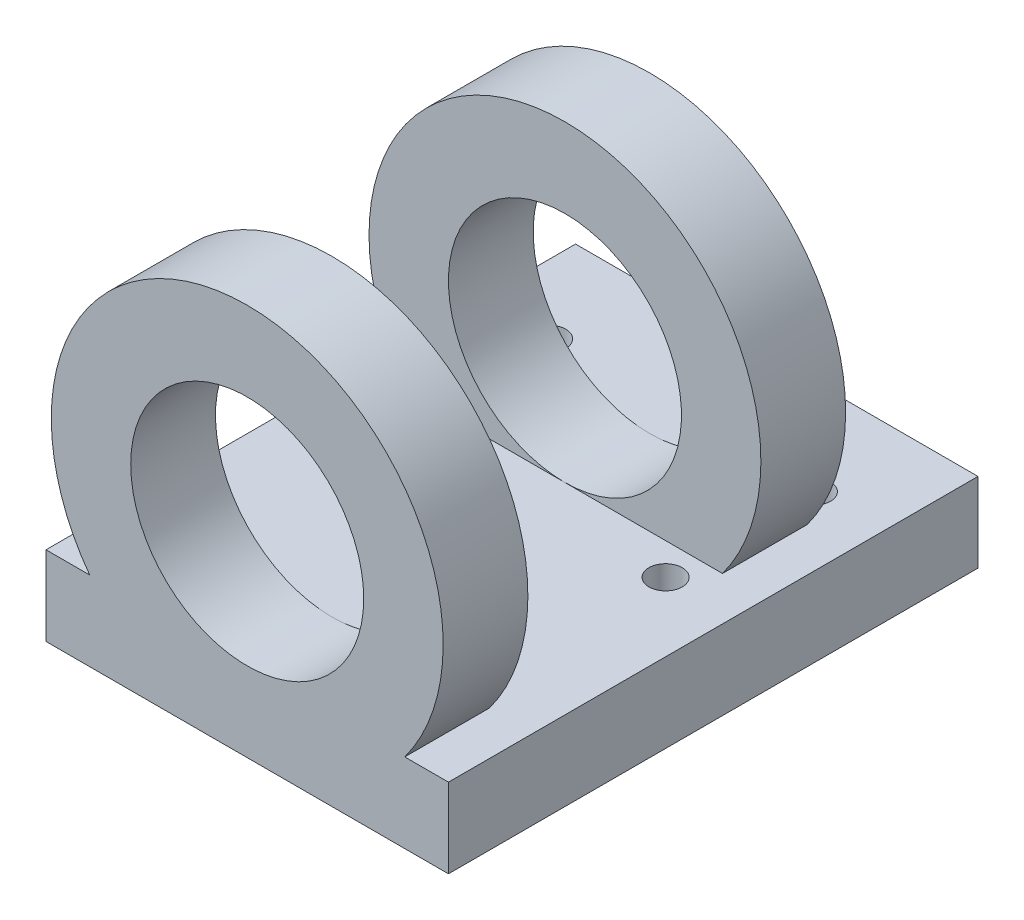
ISO-10303-21;
HEADER;
FILE_DESCRIPTION(('STEP AP214'),'2;1');
FILE_NAME('part.step','',(''),(''),'','','');
FILE_SCHEMA(('AUTOMOTIVE_DESIGN { 1 0 10303 214 1 1 1 1 }'));
ENDSEC;
DATA;
#1=APPLICATION_CONTEXT('core data for automotive mechanical design processes');
#2=APPLICATION_PROTOCOL_DEFINITION('international standard','automotive_design',2000,#1);
#3=PRODUCT_CONTEXT('',#1,'mechanical');
#4=PRODUCT('Part','Part','',(#3));
#5=PRODUCT_RELATED_PRODUCT_CATEGORY('part','',(#4));
#6=PRODUCT_DEFINITION_FORMATION('','',#4);
#7=PRODUCT_DEFINITION_CONTEXT('part definition',#1,'design');
#8=PRODUCT_DEFINITION('design','',#6,#7);
#9=PRODUCT_DEFINITION_SHAPE('','',#8);
#10=(LENGTH_UNIT() NAMED_UNIT(*) SI_UNIT(.MILLI.,.METRE.));
#11=(NAMED_UNIT(*) PLANE_ANGLE_UNIT() SI_UNIT($,.RADIAN.));
#12=(NAMED_UNIT(*) SI_UNIT($,.STERADIAN.) SOLID_ANGLE_UNIT());
#13=UNCERTAINTY_MEASURE_WITH_UNIT(LENGTH_MEASURE(1.E-05),#10,'distance_accuracy_value','');
#14=(GEOMETRIC_REPRESENTATION_CONTEXT(3) GLOBAL_UNCERTAINTY_ASSIGNED_CONTEXT((#13)) GLOBAL_UNIT_ASSIGNED_CONTEXT((#10,
#11,#12)) REPRESENTATION_CONTEXT('',''));
#15=CARTESIAN_POINT('',(0.,0.,0.));
#16=DIRECTION('',(0.,0.,1.));
#17=DIRECTION('',(1.,0.,0.));
#18=AXIS2_PLACEMENT_3D('',#15,#16,#17);
#19=CARTESIAN_POINT('',(0.,-11.,-20.));
#20=DIRECTION('',(0.,-1.,0.));
#21=DIRECTION('',(0.,0.,-1.));
#22=AXIS2_PLACEMENT_3D('',#19,#20,#21);
#23=PLANE('',#22);
#24=CARTESIAN_POINT('',(-12.5,-11.,-11.));
#25=DIRECTION('',(0.,1.,0.));
#26=DIRECTION('',(0.,0.,1.));
#27=AXIS2_PLACEMENT_3D('',#24,#25,#26);
#28=CIRCLE('',#27,1.575);
#29=CARTESIAN_POINT('',(-12.5,-11.,-9.425));
#30=VERTEX_POINT('',#29);
#31=EDGE_CURVE('E267',#30,#30,#28,.T.);
#32=ORIENTED_EDGE('',*,*,#31,.F.);
#33=EDGE_LOOP('',(#32));
#34=FACE_BOUND('',#33,.T.);
#35=CARTESIAN_POINT('',(12.5,-11.,-11.));
#36=DIRECTION('',(0.,-1.,0.));
#37=DIRECTION('',(0.,0.,-1.));
#38=AXIS2_PLACEMENT_3D('',#35,#36,#37);
#39=CIRCLE('',#38,1.57500000000002);
#40=CARTESIAN_POINT('',(12.5,-11.,-12.575));
#41=VERTEX_POINT('',#40);
#42=EDGE_CURVE('E266',#41,#41,#39,.T.);
#43=ORIENTED_EDGE('',*,*,#42,.T.);
#44=EDGE_LOOP('',(#43));
#45=FACE_BOUND('',#44,.T.);
#46=CARTESIAN_POINT('',(-12.5,-11.,3.));
#47=DIRECTION('',(0.,-1.,0.));
#48=DIRECTION('',(0.,0.,-1.));
#49=AXIS2_PLACEMENT_3D('',#46,#47,#48);
#50=CIRCLE('',#49,1.575);
#51=CARTESIAN_POINT('',(-12.5,-11.,1.425));
#52=VERTEX_POINT('',#51);
#53=EDGE_CURVE('E277',#52,#52,#50,.T.);
#54=ORIENTED_EDGE('',*,*,#53,.T.);
#55=EDGE_LOOP('',(#54));
#56=FACE_BOUND('',#55,.T.);
#57=DIRECTION('',(-1.,0.,0.));
#58=VECTOR('',#57,1.);
#59=CARTESIAN_POINT('',(0.,-11.,22.));
#60=LINE('',#59,#58);
#61=CARTESIAN_POINT('',(14.8744747806435,-11.,22.));
#62=VERTEX_POINT('',#61);
#63=CARTESIAN_POINT('',(0.,-11.,22.));
#64=VERTEX_POINT('',#63);
#65=EDGE_CURVE('E60',#62,#64,#60,.T.);
#66=ORIENTED_EDGE('',*,*,#65,.F.);
#67=DIRECTION('',(0.,0.,1.));
#68=VECTOR('',#67,1.);
#69=CARTESIAN_POINT('',(14.8744747806435,-11.,22.));
#70=LINE('',#69,#68);
#71=CARTESIAN_POINT('',(14.8744747806435,-11.,30.));
#72=VERTEX_POINT('',#71);
#73=EDGE_CURVE('E299',#62,#72,#70,.T.);
#74=ORIENTED_EDGE('',*,*,#73,.T.);
#75=DIRECTION('',(1.,0.,0.));
#76=VECTOR('',#75,1.);
#77=CARTESIAN_POINT('',(0.,-11.,30.));
#78=LINE('',#77,#76);
#79=CARTESIAN_POINT('',(19.,-11.,30.));
#80=VERTEX_POINT('',#79);
#81=EDGE_CURVE('E138',#72,#80,#78,.T.);
#82=ORIENTED_EDGE('',*,*,#81,.T.);
#83=DIRECTION('',(0.,0.,1.));
#84=VECTOR('',#83,1.);
#85=CARTESIAN_POINT('',(19.,-11.,-20.));
#86=LINE('',#85,#84);
#87=CARTESIAN_POINT('',(19.,-11.,-20.));
#88=VERTEX_POINT('',#87);
#89=EDGE_CURVE('E158',#88,#80,#86,.T.);
#90=ORIENTED_EDGE('',*,*,#89,.F.);
#91=DIRECTION('',(1.,0.,0.));
#92=VECTOR('',#91,1.);
#93=CARTESIAN_POINT('',(0.,-11.,-20.));
#94=LINE('',#93,#92);
#95=CARTESIAN_POINT('',(-19.,-11.,-20.));
#96=VERTEX_POINT('',#95);
#97=EDGE_CURVE('E122',#96,#88,#94,.T.);
#98=ORIENTED_EDGE('',*,*,#97,.F.);
#99=DIRECTION('',(0.,0.,1.));
#100=VECTOR('',#99,1.);
#101=CARTESIAN_POINT('',(-19.,-11.,-20.));
#102=LINE('',#101,#100);
#103=CARTESIAN_POINT('',(-19.,-11.,30.));
#104=VERTEX_POINT('',#103);
#105=EDGE_CURVE('E117',#96,#104,#102,.T.);
#106=ORIENTED_EDGE('',*,*,#105,.T.);
#107=CARTESIAN_POINT('',(-14.8744747806435,-11.,30.));
#108=VERTEX_POINT('',#107);
#109=EDGE_CURVE('E120',#104,#108,#78,.T.);
#110=ORIENTED_EDGE('',*,*,#109,.T.);
#111=DIRECTION('',(0.,0.,1.));
#112=VECTOR('',#111,1.);
#113=CARTESIAN_POINT('',(-14.8744747806435,-11.,22.));
#114=LINE('',#113,#112);
#115=CARTESIAN_POINT('',(-14.8744747806435,-11.,22.));
#116=VERTEX_POINT('',#115);
#117=EDGE_CURVE('E66',#108,#116,#114,.F.);
#118=ORIENTED_EDGE('',*,*,#117,.T.);
#119=EDGE_CURVE('E300',#64,#116,#60,.T.);
#120=ORIENTED_EDGE('',*,*,#119,.F.);
#121=EDGE_LOOP('',(#66,#74,#82,#90,#98,#106,#110,#118,#120));
#122=FACE_BOUND('',#121,.T.);
#123=DIRECTION('',(0.,0.,1.));
#124=VECTOR('',#123,1.);
#125=CARTESIAN_POINT('',(-14.8744747806435,-11.,-8.));
#126=LINE('',#125,#124);
#127=CARTESIAN_POINT('',(-14.8744747806435,-11.,-8.));
#128=VERTEX_POINT('',#127);
#129=CARTESIAN_POINT('',(-14.8744747806435,-11.,0.));
#130=VERTEX_POINT('',#129);
#131=EDGE_CURVE('E175',#128,#130,#126,.T.);
#132=ORIENTED_EDGE('',*,*,#131,.F.);
#133=DIRECTION('',(1.,0.,0.));
#134=VECTOR('',#133,1.);
#135=CARTESIAN_POINT('',(0.,-11.,-8.));
#136=LINE('',#135,#134);
#137=CARTESIAN_POINT('',(0.,-11.,-8.));
#138=VERTEX_POINT('',#137);
#139=EDGE_CURVE('E172',#128,#138,#136,.T.);
#140=ORIENTED_EDGE('',*,*,#139,.T.);
#141=CARTESIAN_POINT('',(14.8744747806435,-11.,-8.));
#142=VERTEX_POINT('',#141);
#143=EDGE_CURVE('E168',#138,#142,#136,.T.);
#144=ORIENTED_EDGE('',*,*,#143,.T.);
#145=DIRECTION('',(0.,0.,1.));
#146=VECTOR('',#145,1.);
#147=CARTESIAN_POINT('',(14.8744747806435,-11.,-8.));
#148=LINE('',#147,#146);
#149=CARTESIAN_POINT('',(14.8744747806435,-11.,0.));
#150=VERTEX_POINT('',#149);
#151=EDGE_CURVE('E171',#150,#142,#148,.F.);
#152=ORIENTED_EDGE('',*,*,#151,.F.);
#153=DIRECTION('',(1.,0.,0.));
#154=VECTOR('',#153,1.);
#155=CARTESIAN_POINT('',(0.,-11.,0.));
#156=LINE('',#155,#154);
#157=CARTESIAN_POINT('',(0.,-11.,0.));
#158=VERTEX_POINT('',#157);
#159=EDGE_CURVE('E161',#158,#150,#156,.T.);
#160=ORIENTED_EDGE('',*,*,#159,.F.);
#161=EDGE_CURVE('E169',#130,#158,#156,.T.);
#162=ORIENTED_EDGE('',*,*,#161,.F.);
#163=EDGE_LOOP('',(#132,#140,#144,#152,#160,#162));
#164=FACE_BOUND('',#163,.T.);
#165=CARTESIAN_POINT('',(12.5,-11.,3.));
#166=DIRECTION('',(0.,1.,0.));
#167=DIRECTION('',(0.,0.,1.));
#168=AXIS2_PLACEMENT_3D('',#165,#166,#167);
#169=CIRCLE('',#168,1.57500000000002);
#170=CARTESIAN_POINT('',(12.5,-11.,4.57500000000001));
#171=VERTEX_POINT('',#170);
#172=EDGE_CURVE('E278',#171,#171,#169,.T.);
#173=ORIENTED_EDGE('',*,*,#172,.F.);
#174=EDGE_LOOP('',(#173));
#175=FACE_BOUND('',#174,.T.);
#176=ADVANCED_FACE('F45',(#34,#45,#56,#122,#164,#175),#23,.F.);
#177=CARTESIAN_POINT('',(0.,-18.5,-20.));
#178=DIRECTION('',(0.,-1.,0.));
#179=DIRECTION('',(0.,0.,-1.));
#180=AXIS2_PLACEMENT_3D('',#177,#178,#179);
#181=PLANE('',#180);
#182=CARTESIAN_POINT('',(12.5,-18.5,-11.));
#183=DIRECTION('',(0.,-1.,0.));
#184=DIRECTION('',(0.,0.,-1.));
#185=AXIS2_PLACEMENT_3D('',#182,#183,#184);
#186=CIRCLE('',#185,1.57500000000002);
#187=CARTESIAN_POINT('',(12.5,-18.5,-12.575));
#188=VERTEX_POINT('',#187);
#189=EDGE_CURVE('E263',#188,#188,#186,.T.);
#190=ORIENTED_EDGE('',*,*,#189,.F.);
#191=EDGE_LOOP('',(#190));
#192=FACE_BOUND('',#191,.T.);
#193=CARTESIAN_POINT('',(-12.5,-18.5,3.));
#194=DIRECTION('',(0.,-1.,0.));
#195=DIRECTION('',(0.,0.,-1.));
#196=AXIS2_PLACEMENT_3D('',#193,#194,#195);
#197=CIRCLE('',#196,1.575);
#198=CARTESIAN_POINT('',(-12.5,-18.5,1.425));
#199=VERTEX_POINT('',#198);
#200=EDGE_CURVE('E285',#199,#199,#197,.T.);
#201=ORIENTED_EDGE('',*,*,#200,.F.);
#202=EDGE_LOOP('',(#201));
#203=FACE_BOUND('',#202,.T.);
#204=DIRECTION('',(0.,0.,1.));
#205=VECTOR('',#204,1.);
#206=CARTESIAN_POINT('',(19.,-18.5,-20.));
#207=LINE('',#206,#205);
#208=CARTESIAN_POINT('',(19.,-18.5,-20.));
#209=VERTEX_POINT('',#208);
#210=CARTESIAN_POINT('',(19.,-18.5,30.));
#211=VERTEX_POINT('',#210);
#212=EDGE_CURVE('E162',#209,#211,#207,.T.);
#213=ORIENTED_EDGE('',*,*,#212,.T.);
#214=DIRECTION('',(1.,0.,0.));
#215=VECTOR('',#214,1.);
#216=CARTESIAN_POINT('',(0.,-18.5,30.));
#217=LINE('',#216,#215);
#218=CARTESIAN_POINT('',(-19.,-18.5,30.));
#219=VERTEX_POINT('',#218);
#220=EDGE_CURVE('E142',#219,#211,#217,.T.);
#221=ORIENTED_EDGE('',*,*,#220,.F.);
#222=DIRECTION('',(0.,0.,1.));
#223=VECTOR('',#222,1.);
#224=CARTESIAN_POINT('',(-19.,-18.5,-20.));
#225=LINE('',#224,#223);
#226=CARTESIAN_POINT('',(-19.,-18.5,-20.));
#227=VERTEX_POINT('',#226);
#228=EDGE_CURVE('E126',#227,#219,#225,.T.);
#229=ORIENTED_EDGE('',*,*,#228,.F.);
#230=DIRECTION('',(1.,0.,0.));
#231=VECTOR('',#230,1.);
#232=CARTESIAN_POINT('',(0.,-18.5,-20.));
#233=LINE('',#232,#231);
#234=EDGE_CURVE('E153',#227,#209,#233,.T.);
#235=ORIENTED_EDGE('',*,*,#234,.T.);
#236=EDGE_LOOP('',(#213,#221,#229,#235));
#237=FACE_BOUND('',#236,.T.);
#238=CARTESIAN_POINT('',(-12.5,-18.5,-11.));
#239=DIRECTION('',(0.,-1.,0.));
#240=DIRECTION('',(0.,0.,-1.));
#241=AXIS2_PLACEMENT_3D('',#238,#239,#240);
#242=CIRCLE('',#241,1.575);
#243=CARTESIAN_POINT('',(-12.5,-18.5,-12.575));
#244=VERTEX_POINT('',#243);
#245=EDGE_CURVE('E270',#244,#244,#242,.F.);
#246=ORIENTED_EDGE('',*,*,#245,.T.);
#247=EDGE_LOOP('',(#246));
#248=FACE_BOUND('',#247,.T.);
#249=CARTESIAN_POINT('',(12.5,-18.5,3.));
#250=DIRECTION('',(0.,-1.,0.));
#251=DIRECTION('',(0.,0.,-1.));
#252=AXIS2_PLACEMENT_3D('',#249,#250,#251);
#253=CIRCLE('',#252,1.57500000000002);
#254=CARTESIAN_POINT('',(12.5,-18.5,1.42499999999998));
#255=VERTEX_POINT('',#254);
#256=EDGE_CURVE('E274',#255,#255,#253,.F.);
#257=ORIENTED_EDGE('',*,*,#256,.T.);
#258=EDGE_LOOP('',(#257));
#259=FACE_BOUND('',#258,.T.);
#260=ADVANCED_FACE('F209',(#192,#203,#237,#248,#259),#181,.T.);
#261=CARTESIAN_POINT('',(0.,0.,-8.));
#262=DIRECTION('',(0.,0.,1.));
#263=DIRECTION('',(1.,0.,0.));
#264=AXIS2_PLACEMENT_3D('',#261,#262,#263);
#265=CYLINDRICAL_SURFACE('',#264,18.5);
#266=CARTESIAN_POINT('',(0.,0.,0.));
#267=DIRECTION('',(0.,0.,1.));
#268=DIRECTION('',(1.,0.,0.));
#269=AXIS2_PLACEMENT_3D('',#266,#267,#268);
#270=CIRCLE('',#269,18.5);
#271=EDGE_CURVE('E49',#150,#130,#270,.T.);
#272=ORIENTED_EDGE('',*,*,#271,.F.);
#273=ORIENTED_EDGE('',*,*,#151,.T.);
#274=CARTESIAN_POINT('',(0.,0.,-8.));
#275=DIRECTION('',(0.,0.,1.));
#276=DIRECTION('',(1.,0.,0.));
#277=AXIS2_PLACEMENT_3D('',#274,#275,#276);
#278=CIRCLE('',#277,18.5);
#279=EDGE_CURVE('E12',#142,#128,#278,.T.);
#280=ORIENTED_EDGE('',*,*,#279,.T.);
#281=ORIENTED_EDGE('',*,*,#131,.T.);
#282=EDGE_LOOP('',(#272,#273,#280,#281));
#283=FACE_BOUND('',#282,.T.);
#284=ADVANCED_FACE('F47',(#283),#265,.T.);
#285=CARTESIAN_POINT('',(0.,0.,-8.));
#286=DIRECTION('',(0.,0.,1.));
#287=DIRECTION('',(1.,0.,0.));
#288=AXIS2_PLACEMENT_3D('',#285,#286,#287);
#289=PLANE('',#288);
#290=ORIENTED_EDGE('',*,*,#139,.F.);
#291=ORIENTED_EDGE('',*,*,#279,.F.);
#292=ORIENTED_EDGE('',*,*,#143,.F.);
#293=CARTESIAN_POINT('',(0.,0.,-8.));
#294=DIRECTION('',(0.,0.,1.));
#295=DIRECTION('',(1.,0.,0.));
#296=AXIS2_PLACEMENT_3D('',#293,#294,#295);
#297=CIRCLE('',#296,11.);
#298=EDGE_CURVE('E178',#138,#138,#297,.T.);
#299=ORIENTED_EDGE('',*,*,#298,.T.);
#300=EDGE_LOOP('',(#290,#291,#292,#299));
#301=FACE_BOUND('',#300,.T.);
#302=ADVANCED_FACE('F190',(#301),#289,.F.);
#303=CARTESIAN_POINT('',(0.,0.,0.));
#304=DIRECTION('',(0.,0.,1.));
#305=DIRECTION('',(1.,0.,0.));
#306=AXIS2_PLACEMENT_3D('',#303,#304,#305);
#307=PLANE('',#306);
#308=ORIENTED_EDGE('',*,*,#271,.T.);
#309=ORIENTED_EDGE('',*,*,#161,.T.);
#310=CARTESIAN_POINT('',(0.,0.,0.));
#311=DIRECTION('',(0.,0.,1.));
#312=DIRECTION('',(1.,0.,0.));
#313=AXIS2_PLACEMENT_3D('',#310,#311,#312);
#314=CIRCLE('',#313,11.);
#315=EDGE_CURVE('E181',#158,#158,#314,.T.);
#316=ORIENTED_EDGE('',*,*,#315,.F.);
#317=ORIENTED_EDGE('',*,*,#159,.T.);
#318=EDGE_LOOP('',(#308,#309,#316,#317));
#319=FACE_BOUND('',#318,.T.);
#320=ADVANCED_FACE('F197',(#319),#307,.T.);
#321=CARTESIAN_POINT('',(0.,0.,-8.));
#322=DIRECTION('',(0.,0.,1.));
#323=DIRECTION('',(1.,0.,0.));
#324=AXIS2_PLACEMENT_3D('',#321,#322,#323);
#325=CYLINDRICAL_SURFACE('',#324,11.);
#326=ORIENTED_EDGE('',*,*,#298,.F.);
#327=EDGE_LOOP('',(#326));
#328=FACE_BOUND('',#327,.T.);
#329=ORIENTED_EDGE('',*,*,#315,.T.);
#330=EDGE_LOOP('',(#329));
#331=FACE_BOUND('',#330,.T.);
#332=ADVANCED_FACE('F199',(#328,#331),#325,.F.);
#333=CARTESIAN_POINT('',(19.,0.,-20.));
#334=DIRECTION('',(1.,0.,0.));
#335=DIRECTION('',(0.,0.,-1.));
#336=AXIS2_PLACEMENT_3D('',#333,#334,#335);
#337=PLANE('',#336);
#338=ORIENTED_EDGE('',*,*,#89,.T.);
#339=DIRECTION('',(0.,1.,0.));
#340=VECTOR('',#339,1.);
#341=CARTESIAN_POINT('',(19.,0.,30.));
#342=LINE('',#341,#340);
#343=EDGE_CURVE('E144',#211,#80,#342,.T.);
#344=ORIENTED_EDGE('',*,*,#343,.F.);
#345=ORIENTED_EDGE('',*,*,#212,.F.);
#346=DIRECTION('',(0.,1.,0.));
#347=VECTOR('',#346,1.);
#348=CARTESIAN_POINT('',(19.,0.,-20.));
#349=LINE('',#348,#347);
#350=EDGE_CURVE('E127',#209,#88,#349,.T.);
#351=ORIENTED_EDGE('',*,*,#350,.T.);
#352=EDGE_LOOP('',(#338,#344,#345,#351));
#353=FACE_BOUND('',#352,.T.);
#354=ADVANCED_FACE('F204',(#353),#337,.T.);
#355=CARTESIAN_POINT('',(-19.,0.,-20.));
#356=DIRECTION('',(1.,0.,0.));
#357=DIRECTION('',(0.,0.,-1.));
#358=AXIS2_PLACEMENT_3D('',#355,#356,#357);
#359=PLANE('',#358);
#360=ORIENTED_EDGE('',*,*,#228,.T.);
#361=DIRECTION('',(0.,1.,0.));
#362=VECTOR('',#361,1.);
#363=CARTESIAN_POINT('',(-19.,0.,30.));
#364=LINE('',#363,#362);
#365=EDGE_CURVE('E135',#219,#104,#364,.T.);
#366=ORIENTED_EDGE('',*,*,#365,.T.);
#367=ORIENTED_EDGE('',*,*,#105,.F.);
#368=DIRECTION('',(0.,1.,0.));
#369=VECTOR('',#368,1.);
#370=CARTESIAN_POINT('',(-19.,0.,-20.));
#371=LINE('',#370,#369);
#372=EDGE_CURVE('E151',#227,#96,#371,.T.);
#373=ORIENTED_EDGE('',*,*,#372,.F.);
#374=EDGE_LOOP('',(#360,#366,#367,#373));
#375=FACE_BOUND('',#374,.T.);
#376=ADVANCED_FACE('F140',(#375),#359,.F.);
#377=CARTESIAN_POINT('',(0.,0.,-20.));
#378=DIRECTION('',(0.,0.,1.));
#379=DIRECTION('',(1.,0.,0.));
#380=AXIS2_PLACEMENT_3D('',#377,#378,#379);
#381=PLANE('',#380);
#382=ORIENTED_EDGE('',*,*,#97,.T.);
#383=ORIENTED_EDGE('',*,*,#350,.F.);
#384=ORIENTED_EDGE('',*,*,#234,.F.);
#385=ORIENTED_EDGE('',*,*,#372,.T.);
#386=EDGE_LOOP('',(#382,#383,#384,#385));
#387=FACE_BOUND('',#386,.T.);
#388=ADVANCED_FACE('F221',(#387),#381,.F.);
#389=CARTESIAN_POINT('',(0.,0.,30.));
#390=DIRECTION('',(0.,0.,1.));
#391=DIRECTION('',(1.,0.,0.));
#392=AXIS2_PLACEMENT_3D('',#389,#390,#391);
#393=PLANE('',#392);
#394=ORIENTED_EDGE('',*,*,#81,.F.);
#395=CARTESIAN_POINT('',(0.,0.,30.));
#396=DIRECTION('',(0.,0.,1.));
#397=DIRECTION('',(1.,0.,0.));
#398=AXIS2_PLACEMENT_3D('',#395,#396,#397);
#399=CIRCLE('',#398,18.5);
#400=EDGE_CURVE('E137',#72,#108,#399,.T.);
#401=ORIENTED_EDGE('',*,*,#400,.T.);
#402=ORIENTED_EDGE('',*,*,#109,.F.);
#403=ORIENTED_EDGE('',*,*,#365,.F.);
#404=ORIENTED_EDGE('',*,*,#220,.T.);
#405=ORIENTED_EDGE('',*,*,#343,.T.);
#406=EDGE_LOOP('',(#394,#401,#402,#403,#404,#405));
#407=FACE_BOUND('',#406,.T.);
#408=CARTESIAN_POINT('',(0.,0.,30.));
#409=DIRECTION('',(0.,0.,1.));
#410=DIRECTION('',(1.,0.,0.));
#411=AXIS2_PLACEMENT_3D('',#408,#409,#410);
#412=CIRCLE('',#411,11.);
#413=CARTESIAN_POINT('',(11.,0.,30.));
#414=VERTEX_POINT('',#413);
#415=EDGE_CURVE('E288',#414,#414,#412,.T.);
#416=ORIENTED_EDGE('',*,*,#415,.F.);
#417=EDGE_LOOP('',(#416));
#418=FACE_BOUND('',#417,.T.);
#419=ADVANCED_FACE('F133',(#407,#418),#393,.T.);
#420=CARTESIAN_POINT('',(0.,0.,22.));
#421=DIRECTION('',(0.,0.,1.));
#422=DIRECTION('',(1.,0.,0.));
#423=AXIS2_PLACEMENT_3D('',#420,#421,#422);
#424=PLANE('',#423);
#425=CARTESIAN_POINT('',(0.,0.,22.));
#426=DIRECTION('',(0.,0.,1.));
#427=DIRECTION('',(1.,0.,0.));
#428=AXIS2_PLACEMENT_3D('',#425,#426,#427);
#429=CIRCLE('',#428,18.5);
#430=EDGE_CURVE('E294',#62,#116,#429,.T.);
#431=ORIENTED_EDGE('',*,*,#430,.F.);
#432=ORIENTED_EDGE('',*,*,#65,.T.);
#433=CARTESIAN_POINT('',(0.,0.,22.));
#434=DIRECTION('',(0.,0.,1.));
#435=DIRECTION('',(1.,0.,0.));
#436=AXIS2_PLACEMENT_3D('',#433,#434,#435);
#437=CIRCLE('',#436,11.);
#438=EDGE_CURVE('E289',#64,#64,#437,.T.);
#439=ORIENTED_EDGE('',*,*,#438,.T.);
#440=ORIENTED_EDGE('',*,*,#119,.T.);
#441=EDGE_LOOP('',(#431,#432,#439,#440));
#442=FACE_BOUND('',#441,.T.);
#443=ADVANCED_FACE('F231',(#442),#424,.F.);
#444=CARTESIAN_POINT('',(0.,0.,22.));
#445=DIRECTION('',(0.,0.,1.));
#446=DIRECTION('',(1.,0.,0.));
#447=AXIS2_PLACEMENT_3D('',#444,#445,#446);
#448=CYLINDRICAL_SURFACE('',#447,18.5);
#449=ORIENTED_EDGE('',*,*,#73,.F.);
#450=ORIENTED_EDGE('',*,*,#430,.T.);
#451=ORIENTED_EDGE('',*,*,#117,.F.);
#452=ORIENTED_EDGE('',*,*,#400,.F.);
#453=EDGE_LOOP('',(#449,#450,#451,#452));
#454=FACE_BOUND('',#453,.T.);
#455=ADVANCED_FACE('F232',(#454),#448,.T.);
#456=CARTESIAN_POINT('',(0.,0.,22.));
#457=DIRECTION('',(0.,0.,1.));
#458=DIRECTION('',(1.,0.,0.));
#459=AXIS2_PLACEMENT_3D('',#456,#457,#458);
#460=CYLINDRICAL_SURFACE('',#459,11.);
#461=ORIENTED_EDGE('',*,*,#415,.T.);
#462=EDGE_LOOP('',(#461));
#463=FACE_BOUND('',#462,.T.);
#464=ORIENTED_EDGE('',*,*,#438,.F.);
#465=EDGE_LOOP('',(#464));
#466=FACE_BOUND('',#465,.T.);
#467=ADVANCED_FACE('F235',(#463,#466),#460,.F.);
#468=CARTESIAN_POINT('',(-12.5,-18.501,3.));
#469=DIRECTION('',(0.,1.,0.));
#470=DIRECTION('',(0.,0.,1.));
#471=AXIS2_PLACEMENT_3D('',#468,#469,#470);
#472=CYLINDRICAL_SURFACE('',#471,1.575);
#473=ORIENTED_EDGE('',*,*,#200,.T.);
#474=EDGE_LOOP('',(#473));
#475=FACE_BOUND('',#474,.T.);
#476=ORIENTED_EDGE('',*,*,#53,.F.);
#477=EDGE_LOOP('',(#476));
#478=FACE_BOUND('',#477,.T.);
#479=ADVANCED_FACE('F242',(#475,#478),#472,.F.);
#480=CARTESIAN_POINT('',(12.5,-18.501,-11.));
#481=DIRECTION('',(0.,1.,0.));
#482=DIRECTION('',(0.,0.,1.));
#483=AXIS2_PLACEMENT_3D('',#480,#481,#482);
#484=CYLINDRICAL_SURFACE('',#483,1.57500000000002);
#485=ORIENTED_EDGE('',*,*,#189,.T.);
#486=EDGE_LOOP('',(#485));
#487=FACE_BOUND('',#486,.T.);
#488=ORIENTED_EDGE('',*,*,#42,.F.);
#489=EDGE_LOOP('',(#488));
#490=FACE_BOUND('',#489,.T.);
#491=ADVANCED_FACE('F246',(#487,#490),#484,.F.);
#492=CARTESIAN_POINT('',(-12.5,-18.501,-11.));
#493=DIRECTION('',(0.,1.,0.));
#494=DIRECTION('',(0.,0.,1.));
#495=AXIS2_PLACEMENT_3D('',#492,#493,#494);
#496=CYLINDRICAL_SURFACE('',#495,1.575);
#497=ORIENTED_EDGE('',*,*,#245,.F.);
#498=EDGE_LOOP('',(#497));
#499=FACE_BOUND('',#498,.T.);
#500=ORIENTED_EDGE('',*,*,#31,.T.);
#501=EDGE_LOOP('',(#500));
#502=FACE_BOUND('',#501,.T.);
#503=ADVANCED_FACE('F248',(#499,#502),#496,.F.);
#504=CARTESIAN_POINT('',(12.5,-18.501,3.));
#505=DIRECTION('',(0.,1.,0.));
#506=DIRECTION('',(0.,0.,1.));
#507=AXIS2_PLACEMENT_3D('',#504,#505,#506);
#508=CYLINDRICAL_SURFACE('',#507,1.57500000000002);
#509=ORIENTED_EDGE('',*,*,#256,.F.);
#510=EDGE_LOOP('',(#509));
#511=FACE_BOUND('',#510,.T.);
#512=ORIENTED_EDGE('',*,*,#172,.T.);
#513=EDGE_LOOP('',(#512));
#514=FACE_BOUND('',#513,.T.);
#515=ADVANCED_FACE('F251',(#511,#514),#508,.F.);
#516=CLOSED_SHELL('',(#176,#260,#284,#302,#320,#332,#354,#376,#388,#419,#443,#455,#467,#479,
#491,#503,#515));
#517=MANIFOLD_SOLID_BREP('B2',#516);
#518=ADVANCED_BREP_SHAPE_REPRESENTATION('',(#18,#517),#14);
#519=SHAPE_DEFINITION_REPRESENTATION(#9,#518);
ENDSEC;
END-ISO-10303-21;
